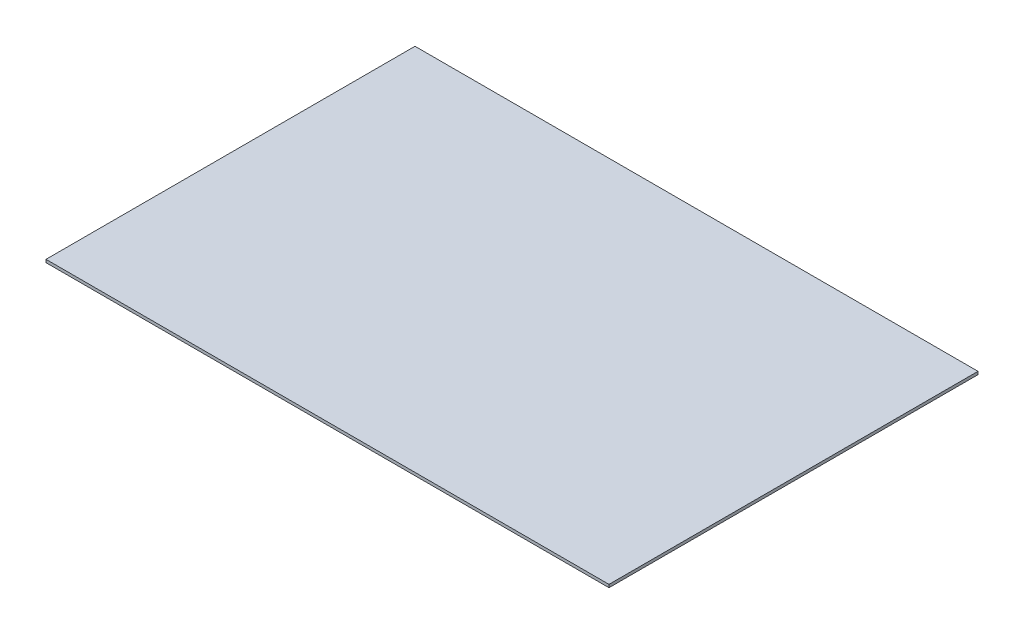
ISO-10303-21;
HEADER;
FILE_DESCRIPTION(('STEP AP214'),'2;1');
FILE_NAME('part.step','',(''),(''),'','','');
FILE_SCHEMA(('AUTOMOTIVE_DESIGN { 1 0 10303 214 1 1 1 1 }'));
ENDSEC;
DATA;
#1=APPLICATION_CONTEXT('core data for automotive mechanical design processes');
#2=APPLICATION_PROTOCOL_DEFINITION('international standard','automotive_design',2000,#1);
#3=PRODUCT_CONTEXT('',#1,'mechanical');
#4=PRODUCT('Part','Part','',(#3));
#5=PRODUCT_RELATED_PRODUCT_CATEGORY('part','',(#4));
#6=PRODUCT_DEFINITION_FORMATION('','',#4);
#7=PRODUCT_DEFINITION_CONTEXT('part definition',#1,'design');
#8=PRODUCT_DEFINITION('design','',#6,#7);
#9=PRODUCT_DEFINITION_SHAPE('','',#8);
#10=(LENGTH_UNIT() NAMED_UNIT(*) SI_UNIT(.MILLI.,.METRE.));
#11=(NAMED_UNIT(*) PLANE_ANGLE_UNIT() SI_UNIT($,.RADIAN.));
#12=(NAMED_UNIT(*) SI_UNIT($,.STERADIAN.) SOLID_ANGLE_UNIT());
#13=UNCERTAINTY_MEASURE_WITH_UNIT(LENGTH_MEASURE(1.E-05),#10,'distance_accuracy_value','');
#14=(GEOMETRIC_REPRESENTATION_CONTEXT(3) GLOBAL_UNCERTAINTY_ASSIGNED_CONTEXT((#13)) GLOBAL_UNIT_ASSIGNED_CONTEXT((#10,
#11,#12)) REPRESENTATION_CONTEXT('',''));
#15=CARTESIAN_POINT('',(0.,0.,0.));
#16=DIRECTION('',(0.,0.,1.));
#17=DIRECTION('',(1.,0.,0.));
#18=AXIS2_PLACEMENT_3D('',#15,#16,#17);
#19=CARTESIAN_POINT('',(191.,2.,-127.5));
#20=DIRECTION('',(-1.,0.,0.));
#21=DIRECTION('',(0.,0.,1.));
#22=AXIS2_PLACEMENT_3D('',#19,#20,#21);
#23=PLANE('',#22);
#24=DIRECTION('',(0.,0.,-1.));
#25=VECTOR('',#24,1.);
#26=CARTESIAN_POINT('',(191.,0.,-127.5));
#27=LINE('',#26,#25);
#28=CARTESIAN_POINT('',(191.,0.,125.5));
#29=VERTEX_POINT('',#28);
#30=CARTESIAN_POINT('',(191.,0.,-127.5));
#31=VERTEX_POINT('',#30);
#32=EDGE_CURVE('E96',#29,#31,#27,.T.);
#33=ORIENTED_EDGE('',*,*,#32,.T.);
#34=DIRECTION('',(0.,-1.,0.));
#35=VECTOR('',#34,1.);
#36=CARTESIAN_POINT('',(191.,2.,-127.5));
#37=LINE('',#36,#35);
#38=CARTESIAN_POINT('',(191.,2.,-127.5));
#39=VERTEX_POINT('',#38);
#40=EDGE_CURVE('E11',#39,#31,#37,.T.);
#41=ORIENTED_EDGE('',*,*,#40,.F.);
#42=DIRECTION('',(0.,0.,-1.));
#43=VECTOR('',#42,1.);
#44=CARTESIAN_POINT('',(191.,2.,-127.5));
#45=LINE('',#44,#43);
#46=CARTESIAN_POINT('',(191.,2.,125.5));
#47=VERTEX_POINT('',#46);
#48=EDGE_CURVE('E84',#47,#39,#45,.T.);
#49=ORIENTED_EDGE('',*,*,#48,.F.);
#50=DIRECTION('',(0.,-1.,0.));
#51=VECTOR('',#50,1.);
#52=CARTESIAN_POINT('',(191.,2.,125.5));
#53=LINE('',#52,#51);
#54=EDGE_CURVE('E92',#47,#29,#53,.T.);
#55=ORIENTED_EDGE('',*,*,#54,.T.);
#56=EDGE_LOOP('',(#33,#41,#49,#55));
#57=FACE_BOUND('',#56,.T.);
#58=ADVANCED_FACE('F33',(#57),#23,.F.);
#59=CARTESIAN_POINT('',(-195.,2.,-127.5));
#60=DIRECTION('',(0.,0.,1.));
#61=DIRECTION('',(1.,0.,0.));
#62=AXIS2_PLACEMENT_3D('',#59,#60,#61);
#63=PLANE('',#62);
#64=DIRECTION('',(-1.,0.,0.));
#65=VECTOR('',#64,1.);
#66=CARTESIAN_POINT('',(-195.,0.,-127.5));
#67=LINE('',#66,#65);
#68=CARTESIAN_POINT('',(-195.,0.,-127.5));
#69=VERTEX_POINT('',#68);
#70=EDGE_CURVE('E88',#31,#69,#67,.T.);
#71=ORIENTED_EDGE('',*,*,#70,.T.);
#72=DIRECTION('',(0.,-1.,0.));
#73=VECTOR('',#72,1.);
#74=CARTESIAN_POINT('',(-195.,2.,-127.5));
#75=LINE('',#74,#73);
#76=CARTESIAN_POINT('',(-195.,2.,-127.5));
#77=VERTEX_POINT('',#76);
#78=EDGE_CURVE('E41',#77,#69,#75,.T.);
#79=ORIENTED_EDGE('',*,*,#78,.F.);
#80=DIRECTION('',(-1.,0.,0.));
#81=VECTOR('',#80,1.);
#82=CARTESIAN_POINT('',(-195.,2.,-127.5));
#83=LINE('',#82,#81);
#84=EDGE_CURVE('E79',#39,#77,#83,.T.);
#85=ORIENTED_EDGE('',*,*,#84,.F.);
#86=ORIENTED_EDGE('',*,*,#40,.T.);
#87=EDGE_LOOP('',(#71,#79,#85,#86));
#88=FACE_BOUND('',#87,.T.);
#89=ADVANCED_FACE('F87',(#88),#63,.F.);
#90=CARTESIAN_POINT('',(-195.,2.,-127.5));
#91=DIRECTION('',(1.,0.,0.));
#92=DIRECTION('',(0.,0.,-1.));
#93=AXIS2_PLACEMENT_3D('',#90,#91,#92);
#94=PLANE('',#93);
#95=DIRECTION('',(0.,0.,1.));
#96=VECTOR('',#95,1.);
#97=CARTESIAN_POINT('',(-195.,0.,-127.5));
#98=LINE('',#97,#96);
#99=CARTESIAN_POINT('',(-195.,0.,125.5));
#100=VERTEX_POINT('',#99);
#101=EDGE_CURVE('E66',#69,#100,#98,.T.);
#102=ORIENTED_EDGE('',*,*,#101,.T.);
#103=DIRECTION('',(0.,-1.,0.));
#104=VECTOR('',#103,1.);
#105=CARTESIAN_POINT('',(-195.,2.,125.5));
#106=LINE('',#105,#104);
#107=CARTESIAN_POINT('',(-195.,2.,125.5));
#108=VERTEX_POINT('',#107);
#109=EDGE_CURVE('E89',#108,#100,#106,.T.);
#110=ORIENTED_EDGE('',*,*,#109,.F.);
#111=DIRECTION('',(0.,0.,1.));
#112=VECTOR('',#111,1.);
#113=CARTESIAN_POINT('',(-195.,2.,-127.5));
#114=LINE('',#113,#112);
#115=EDGE_CURVE('E82',#77,#108,#114,.T.);
#116=ORIENTED_EDGE('',*,*,#115,.F.);
#117=ORIENTED_EDGE('',*,*,#78,.T.);
#118=EDGE_LOOP('',(#102,#110,#116,#117));
#119=FACE_BOUND('',#118,.T.);
#120=ADVANCED_FACE('F90',(#119),#94,.F.);
#121=CARTESIAN_POINT('',(-195.,2.,125.5));
#122=DIRECTION('',(0.,0.,-1.));
#123=DIRECTION('',(-1.,0.,0.));
#124=AXIS2_PLACEMENT_3D('',#121,#122,#123);
#125=PLANE('',#124);
#126=DIRECTION('',(1.,0.,0.));
#127=VECTOR('',#126,1.);
#128=CARTESIAN_POINT('',(-195.,0.,125.5));
#129=LINE('',#128,#127);
#130=EDGE_CURVE('E72',#100,#29,#129,.T.);
#131=ORIENTED_EDGE('',*,*,#130,.T.);
#132=ORIENTED_EDGE('',*,*,#54,.F.);
#133=DIRECTION('',(1.,0.,0.));
#134=VECTOR('',#133,1.);
#135=CARTESIAN_POINT('',(-195.,2.,125.5));
#136=LINE('',#135,#134);
#137=EDGE_CURVE('E49',#108,#47,#136,.T.);
#138=ORIENTED_EDGE('',*,*,#137,.F.);
#139=ORIENTED_EDGE('',*,*,#109,.T.);
#140=EDGE_LOOP('',(#131,#132,#138,#139));
#141=FACE_BOUND('',#140,.T.);
#142=ADVANCED_FACE('F103',(#141),#125,.F.);
#143=CARTESIAN_POINT('',(0.,2.,0.));
#144=DIRECTION('',(0.,1.,0.));
#145=DIRECTION('',(0.,0.,1.));
#146=AXIS2_PLACEMENT_3D('',#143,#144,#145);
#147=PLANE('',#146);
#148=ORIENTED_EDGE('',*,*,#48,.T.);
#149=ORIENTED_EDGE('',*,*,#84,.T.);
#150=ORIENTED_EDGE('',*,*,#115,.T.);
#151=ORIENTED_EDGE('',*,*,#137,.T.);
#152=EDGE_LOOP('',(#148,#149,#150,#151));
#153=FACE_BOUND('',#152,.T.);
#154=ADVANCED_FACE('F80',(#153),#147,.T.);
#155=CARTESIAN_POINT('',(0.,0.,0.));
#156=DIRECTION('',(0.,1.,0.));
#157=DIRECTION('',(0.,0.,1.));
#158=AXIS2_PLACEMENT_3D('',#155,#156,#157);
#159=PLANE('',#158);
#160=ORIENTED_EDGE('',*,*,#32,.F.);
#161=ORIENTED_EDGE('',*,*,#130,.F.);
#162=ORIENTED_EDGE('',*,*,#101,.F.);
#163=ORIENTED_EDGE('',*,*,#70,.F.);
#164=EDGE_LOOP('',(#160,#161,#162,#163));
#165=FACE_BOUND('',#164,.T.);
#166=ADVANCED_FACE('F106',(#165),#159,.F.);
#167=CLOSED_SHELL('',(#58,#89,#120,#142,#154,#166));
#168=MANIFOLD_SOLID_BREP('B2',#167);
#169=ADVANCED_BREP_SHAPE_REPRESENTATION('',(#18,#168),#14);
#170=SHAPE_DEFINITION_REPRESENTATION(#9,#169);
ENDSEC;
END-ISO-10303-21;
